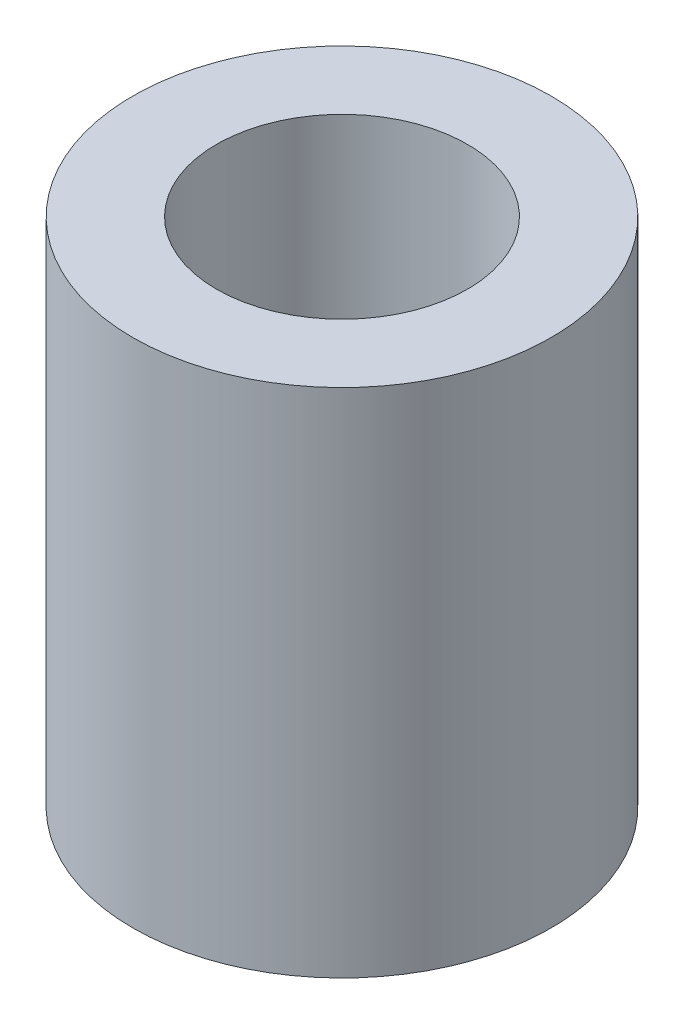
ISO-10303-21;
HEADER;
FILE_DESCRIPTION(('STEP AP214'),'2;1');
FILE_NAME('part.step','',(''),(''),'','','');
FILE_SCHEMA(('AUTOMOTIVE_DESIGN { 1 0 10303 214 1 1 1 1 }'));
ENDSEC;
DATA;
#1=APPLICATION_CONTEXT('core data for automotive mechanical design processes');
#2=APPLICATION_PROTOCOL_DEFINITION('international standard','automotive_design',2000,#1);
#3=PRODUCT_CONTEXT('',#1,'mechanical');
#4=PRODUCT('Part','Part','',(#3));
#5=PRODUCT_RELATED_PRODUCT_CATEGORY('part','',(#4));
#6=PRODUCT_DEFINITION_FORMATION('','',#4);
#7=PRODUCT_DEFINITION_CONTEXT('part definition',#1,'design');
#8=PRODUCT_DEFINITION('design','',#6,#7);
#9=PRODUCT_DEFINITION_SHAPE('','',#8);
#10=(LENGTH_UNIT() NAMED_UNIT(*) SI_UNIT(.MILLI.,.METRE.));
#11=(NAMED_UNIT(*) PLANE_ANGLE_UNIT() SI_UNIT($,.RADIAN.));
#12=(NAMED_UNIT(*) SI_UNIT($,.STERADIAN.) SOLID_ANGLE_UNIT());
#13=UNCERTAINTY_MEASURE_WITH_UNIT(LENGTH_MEASURE(1.E-05),#10,'distance_accuracy_value','');
#14=(GEOMETRIC_REPRESENTATION_CONTEXT(3) GLOBAL_UNCERTAINTY_ASSIGNED_CONTEXT((#13)) GLOBAL_UNIT_ASSIGNED_CONTEXT((#10,
#11,#12)) REPRESENTATION_CONTEXT('',''));
#15=CARTESIAN_POINT('',(0.,0.,0.));
#16=DIRECTION('',(0.,0.,1.));
#17=DIRECTION('',(1.,0.,0.));
#18=AXIS2_PLACEMENT_3D('',#15,#16,#17);
#19=CARTESIAN_POINT('',(0.,48.89,0.));
#20=DIRECTION('',(0.,1.,0.));
#21=DIRECTION('',(0.,0.,1.));
#22=AXIS2_PLACEMENT_3D('',#19,#20,#21);
#23=PLANE('',#22);
#24=CARTESIAN_POINT('',(0.,48.89,0.));
#25=DIRECTION('',(0.,1.,0.));
#26=DIRECTION('',(0.,0.,1.));
#27=AXIS2_PLACEMENT_3D('',#24,#25,#26);
#28=CIRCLE('',#27,20.);
#29=CARTESIAN_POINT('',(0.,48.89,20.));
#30=VERTEX_POINT('',#29);
#31=EDGE_CURVE('E10',#30,#30,#28,.T.);
#32=ORIENTED_EDGE('',*,*,#31,.T.);
#33=EDGE_LOOP('',(#32));
#34=FACE_BOUND('',#33,.T.);
#35=CARTESIAN_POINT('',(0.,48.89,0.));
#36=DIRECTION('',(0.,1.,0.));
#37=DIRECTION('',(0.,0.,1.));
#38=AXIS2_PLACEMENT_3D('',#35,#36,#37);
#39=CIRCLE('',#38,12.);
#40=CARTESIAN_POINT('',(0.,48.89,12.));
#41=VERTEX_POINT('',#40);
#42=EDGE_CURVE('E43',#41,#41,#39,.T.);
#43=ORIENTED_EDGE('',*,*,#42,.F.);
#44=EDGE_LOOP('',(#43));
#45=FACE_BOUND('',#44,.T.);
#46=ADVANCED_FACE('F32',(#34,#45),#23,.T.);
#47=CARTESIAN_POINT('',(0.,0.,0.));
#48=DIRECTION('',(0.,1.,0.));
#49=DIRECTION('',(0.,0.,1.));
#50=AXIS2_PLACEMENT_3D('',#47,#48,#49);
#51=PLANE('',#50);
#52=CARTESIAN_POINT('',(0.,0.,0.));
#53=DIRECTION('',(0.,1.,0.));
#54=DIRECTION('',(0.,0.,1.));
#55=AXIS2_PLACEMENT_3D('',#52,#53,#54);
#56=CIRCLE('',#55,20.);
#57=CARTESIAN_POINT('',(0.,0.,20.));
#58=VERTEX_POINT('',#57);
#59=EDGE_CURVE('E36',#58,#58,#56,.T.);
#60=ORIENTED_EDGE('',*,*,#59,.F.);
#61=EDGE_LOOP('',(#60));
#62=FACE_BOUND('',#61,.T.);
#63=CARTESIAN_POINT('',(0.,0.,0.));
#64=DIRECTION('',(0.,1.,0.));
#65=DIRECTION('',(0.,0.,1.));
#66=AXIS2_PLACEMENT_3D('',#63,#64,#65);
#67=CIRCLE('',#66,12.);
#68=CARTESIAN_POINT('',(0.,0.,12.));
#69=VERTEX_POINT('',#68);
#70=EDGE_CURVE('E45',#69,#69,#67,.T.);
#71=ORIENTED_EDGE('',*,*,#70,.T.);
#72=EDGE_LOOP('',(#71));
#73=FACE_BOUND('',#72,.T.);
#74=ADVANCED_FACE('F55',(#62,#73),#51,.F.);
#75=CARTESIAN_POINT('',(0.,48.89,0.));
#76=DIRECTION('',(0.,-1.,0.));
#77=DIRECTION('',(0.,0.,-1.));
#78=AXIS2_PLACEMENT_3D('',#75,#76,#77);
#79=CYLINDRICAL_SURFACE('',#78,20.);
#80=ORIENTED_EDGE('',*,*,#31,.F.);
#81=EDGE_LOOP('',(#80));
#82=FACE_BOUND('',#81,.T.);
#83=ORIENTED_EDGE('',*,*,#59,.T.);
#84=EDGE_LOOP('',(#83));
#85=FACE_BOUND('',#84,.T.);
#86=ADVANCED_FACE('F34',(#82,#85),#79,.T.);
#87=CARTESIAN_POINT('',(0.,48.89,0.));
#88=DIRECTION('',(0.,-1.,0.));
#89=DIRECTION('',(0.,0.,-1.));
#90=AXIS2_PLACEMENT_3D('',#87,#88,#89);
#91=CYLINDRICAL_SURFACE('',#90,12.);
#92=ORIENTED_EDGE('',*,*,#42,.T.);
#93=EDGE_LOOP('',(#92));
#94=FACE_BOUND('',#93,.T.);
#95=ORIENTED_EDGE('',*,*,#70,.F.);
#96=EDGE_LOOP('',(#95));
#97=FACE_BOUND('',#96,.T.);
#98=ADVANCED_FACE('F51',(#94,#97),#91,.F.);
#99=CLOSED_SHELL('',(#46,#74,#86,#98));
#100=MANIFOLD_SOLID_BREP('B2',#99);
#101=ADVANCED_BREP_SHAPE_REPRESENTATION('',(#18,#100),#14);
#102=SHAPE_DEFINITION_REPRESENTATION(#9,#101);
ENDSEC;
END-ISO-10303-21;
